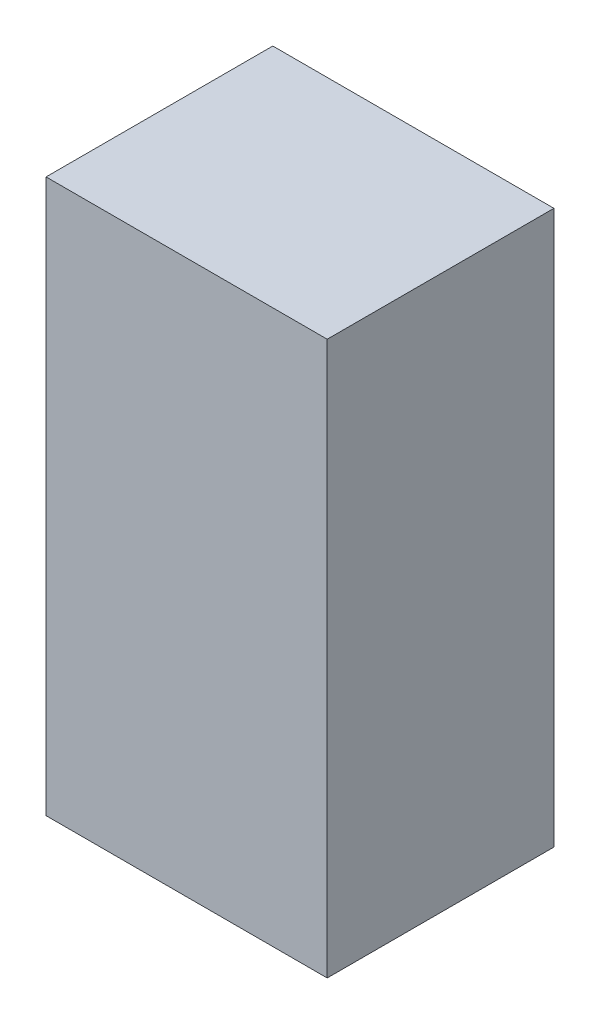
ISO-10303-21;
HEADER;
FILE_DESCRIPTION(('STEP AP214'),'2;1');
FILE_NAME('part.step','',(''),(''),'','','');
FILE_SCHEMA(('AUTOMOTIVE_DESIGN { 1 0 10303 214 1 1 1 1 }'));
ENDSEC;
DATA;
#1=APPLICATION_CONTEXT('core data for automotive mechanical design processes');
#2=APPLICATION_PROTOCOL_DEFINITION('international standard','automotive_design',2000,#1);
#3=PRODUCT_CONTEXT('',#1,'mechanical');
#4=PRODUCT('Part','Part','',(#3));
#5=PRODUCT_RELATED_PRODUCT_CATEGORY('part','',(#4));
#6=PRODUCT_DEFINITION_FORMATION('','',#4);
#7=PRODUCT_DEFINITION_CONTEXT('part definition',#1,'design');
#8=PRODUCT_DEFINITION('design','',#6,#7);
#9=PRODUCT_DEFINITION_SHAPE('','',#8);
#10=(LENGTH_UNIT() NAMED_UNIT(*) SI_UNIT(.MILLI.,.METRE.));
#11=(NAMED_UNIT(*) PLANE_ANGLE_UNIT() SI_UNIT($,.RADIAN.));
#12=(NAMED_UNIT(*) SI_UNIT($,.STERADIAN.) SOLID_ANGLE_UNIT());
#13=UNCERTAINTY_MEASURE_WITH_UNIT(LENGTH_MEASURE(1.E-05),#10,'distance_accuracy_value','');
#14=(GEOMETRIC_REPRESENTATION_CONTEXT(3) GLOBAL_UNCERTAINTY_ASSIGNED_CONTEXT((#13)) GLOBAL_UNIT_ASSIGNED_CONTEXT((#10,
#11,#12)) REPRESENTATION_CONTEXT('',''));
#15=CARTESIAN_POINT('',(0.,0.,0.));
#16=DIRECTION('',(0.,0.,1.));
#17=DIRECTION('',(1.,0.,0.));
#18=AXIS2_PLACEMENT_3D('',#15,#16,#17);
#19=CARTESIAN_POINT('',(15.5,-30.5,25.));
#20=DIRECTION('',(-1.,0.,0.));
#21=DIRECTION('',(0.,0.,1.));
#22=AXIS2_PLACEMENT_3D('',#19,#20,#21);
#23=PLANE('',#22);
#24=DIRECTION('',(0.,1.,0.));
#25=VECTOR('',#24,1.);
#26=CARTESIAN_POINT('',(15.5,-30.5,0.));
#27=LINE('',#26,#25);
#28=CARTESIAN_POINT('',(15.5,-30.5,0.));
#29=VERTEX_POINT('',#28);
#30=CARTESIAN_POINT('',(15.5,30.5,0.));
#31=VERTEX_POINT('',#30);
#32=EDGE_CURVE('E100',#29,#31,#27,.T.);
#33=ORIENTED_EDGE('',*,*,#32,.T.);
#34=DIRECTION('',(0.,0.,-1.));
#35=VECTOR('',#34,1.);
#36=CARTESIAN_POINT('',(15.5,30.5,25.));
#37=LINE('',#36,#35);
#38=CARTESIAN_POINT('',(15.5,30.5,25.));
#39=VERTEX_POINT('',#38);
#40=EDGE_CURVE('E11',#39,#31,#37,.T.);
#41=ORIENTED_EDGE('',*,*,#40,.F.);
#42=DIRECTION('',(0.,1.,0.));
#43=VECTOR('',#42,1.);
#44=CARTESIAN_POINT('',(15.5,-30.5,25.));
#45=LINE('',#44,#43);
#46=CARTESIAN_POINT('',(15.5,-30.5,25.));
#47=VERTEX_POINT('',#46);
#48=EDGE_CURVE('E88',#47,#39,#45,.T.);
#49=ORIENTED_EDGE('',*,*,#48,.F.);
#50=DIRECTION('',(0.,0.,-1.));
#51=VECTOR('',#50,1.);
#52=CARTESIAN_POINT('',(15.5,-30.5,25.));
#53=LINE('',#52,#51);
#54=EDGE_CURVE('E96',#47,#29,#53,.T.);
#55=ORIENTED_EDGE('',*,*,#54,.T.);
#56=EDGE_LOOP('',(#33,#41,#49,#55));
#57=FACE_BOUND('',#56,.T.);
#58=ADVANCED_FACE('F37',(#57),#23,.F.);
#59=CARTESIAN_POINT('',(-15.5,30.5,25.));
#60=DIRECTION('',(0.,-1.,0.));
#61=DIRECTION('',(0.,0.,-1.));
#62=AXIS2_PLACEMENT_3D('',#59,#60,#61);
#63=PLANE('',#62);
#64=DIRECTION('',(-1.,0.,0.));
#65=VECTOR('',#64,1.);
#66=CARTESIAN_POINT('',(-15.5,30.5,0.));
#67=LINE('',#66,#65);
#68=CARTESIAN_POINT('',(-15.5,30.5,0.));
#69=VERTEX_POINT('',#68);
#70=EDGE_CURVE('E92',#31,#69,#67,.T.);
#71=ORIENTED_EDGE('',*,*,#70,.T.);
#72=DIRECTION('',(0.,0.,-1.));
#73=VECTOR('',#72,1.);
#74=CARTESIAN_POINT('',(-15.5,30.5,25.));
#75=LINE('',#74,#73);
#76=CARTESIAN_POINT('',(-15.5,30.5,25.));
#77=VERTEX_POINT('',#76);
#78=EDGE_CURVE('E45',#77,#69,#75,.T.);
#79=ORIENTED_EDGE('',*,*,#78,.F.);
#80=DIRECTION('',(-1.,0.,0.));
#81=VECTOR('',#80,1.);
#82=CARTESIAN_POINT('',(-15.5,30.5,25.));
#83=LINE('',#82,#81);
#84=EDGE_CURVE('E83',#39,#77,#83,.T.);
#85=ORIENTED_EDGE('',*,*,#84,.F.);
#86=ORIENTED_EDGE('',*,*,#40,.T.);
#87=EDGE_LOOP('',(#71,#79,#85,#86));
#88=FACE_BOUND('',#87,.T.);
#89=ADVANCED_FACE('F91',(#88),#63,.F.);
#90=CARTESIAN_POINT('',(-15.5,-30.5,25.));
#91=DIRECTION('',(1.,0.,0.));
#92=DIRECTION('',(0.,0.,-1.));
#93=AXIS2_PLACEMENT_3D('',#90,#91,#92);
#94=PLANE('',#93);
#95=DIRECTION('',(0.,-1.,0.));
#96=VECTOR('',#95,1.);
#97=CARTESIAN_POINT('',(-15.5,-30.5,0.));
#98=LINE('',#97,#96);
#99=CARTESIAN_POINT('',(-15.5,-30.5,0.));
#100=VERTEX_POINT('',#99);
#101=EDGE_CURVE('E70',#69,#100,#98,.T.);
#102=ORIENTED_EDGE('',*,*,#101,.T.);
#103=DIRECTION('',(0.,0.,-1.));
#104=VECTOR('',#103,1.);
#105=CARTESIAN_POINT('',(-15.5,-30.5,25.));
#106=LINE('',#105,#104);
#107=CARTESIAN_POINT('',(-15.5,-30.5,25.));
#108=VERTEX_POINT('',#107);
#109=EDGE_CURVE('E93',#108,#100,#106,.T.);
#110=ORIENTED_EDGE('',*,*,#109,.F.);
#111=DIRECTION('',(0.,-1.,0.));
#112=VECTOR('',#111,1.);
#113=CARTESIAN_POINT('',(-15.5,-30.5,25.));
#114=LINE('',#113,#112);
#115=EDGE_CURVE('E86',#77,#108,#114,.T.);
#116=ORIENTED_EDGE('',*,*,#115,.F.);
#117=ORIENTED_EDGE('',*,*,#78,.T.);
#118=EDGE_LOOP('',(#102,#110,#116,#117));
#119=FACE_BOUND('',#118,.T.);
#120=ADVANCED_FACE('F94',(#119),#94,.F.);
#121=CARTESIAN_POINT('',(-15.5,-30.5,25.));
#122=DIRECTION('',(0.,1.,0.));
#123=DIRECTION('',(0.,0.,1.));
#124=AXIS2_PLACEMENT_3D('',#121,#122,#123);
#125=PLANE('',#124);
#126=DIRECTION('',(1.,0.,0.));
#127=VECTOR('',#126,1.);
#128=CARTESIAN_POINT('',(-15.5,-30.5,0.));
#129=LINE('',#128,#127);
#130=EDGE_CURVE('E76',#100,#29,#129,.T.);
#131=ORIENTED_EDGE('',*,*,#130,.T.);
#132=ORIENTED_EDGE('',*,*,#54,.F.);
#133=DIRECTION('',(1.,0.,0.));
#134=VECTOR('',#133,1.);
#135=CARTESIAN_POINT('',(-15.5,-30.5,25.));
#136=LINE('',#135,#134);
#137=EDGE_CURVE('E53',#108,#47,#136,.T.);
#138=ORIENTED_EDGE('',*,*,#137,.F.);
#139=ORIENTED_EDGE('',*,*,#109,.T.);
#140=EDGE_LOOP('',(#131,#132,#138,#139));
#141=FACE_BOUND('',#140,.T.);
#142=ADVANCED_FACE('F107',(#141),#125,.F.);
#143=CARTESIAN_POINT('',(0.,0.,25.));
#144=DIRECTION('',(0.,0.,-1.));
#145=DIRECTION('',(-1.,0.,0.));
#146=AXIS2_PLACEMENT_3D('',#143,#144,#145);
#147=PLANE('',#146);
#148=ORIENTED_EDGE('',*,*,#48,.T.);
#149=ORIENTED_EDGE('',*,*,#84,.T.);
#150=ORIENTED_EDGE('',*,*,#115,.T.);
#151=ORIENTED_EDGE('',*,*,#137,.T.);
#152=EDGE_LOOP('',(#148,#149,#150,#151));
#153=FACE_BOUND('',#152,.T.);
#154=ADVANCED_FACE('F84',(#153),#147,.F.);
#155=CARTESIAN_POINT('',(0.,0.,0.));
#156=DIRECTION('',(0.,0.,-1.));
#157=DIRECTION('',(-1.,0.,0.));
#158=AXIS2_PLACEMENT_3D('',#155,#156,#157);
#159=PLANE('',#158);
#160=ORIENTED_EDGE('',*,*,#32,.F.);
#161=ORIENTED_EDGE('',*,*,#130,.F.);
#162=ORIENTED_EDGE('',*,*,#101,.F.);
#163=ORIENTED_EDGE('',*,*,#70,.F.);
#164=EDGE_LOOP('',(#160,#161,#162,#163));
#165=FACE_BOUND('',#164,.T.);
#166=ADVANCED_FACE('F110',(#165),#159,.T.);
#167=CLOSED_SHELL('',(#58,#89,#120,#142,#154,#166));
#168=MANIFOLD_SOLID_BREP('B2',#167);
#169=ADVANCED_BREP_SHAPE_REPRESENTATION('',(#18,#168),#14);
#170=SHAPE_DEFINITION_REPRESENTATION(#9,#169);
ENDSEC;
END-ISO-10303-21;
